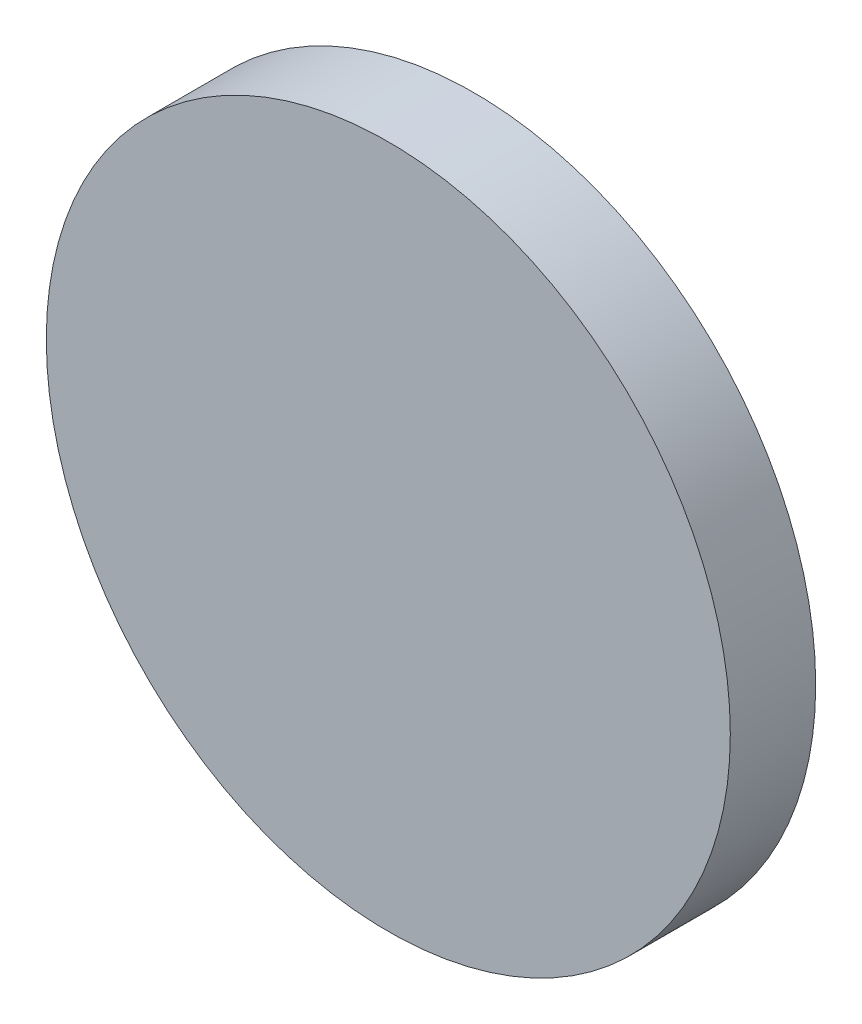
ISO-10303-21;
HEADER;
FILE_DESCRIPTION(('STEP AP214'),'2;1');
FILE_NAME('part.step','',(''),(''),'','','');
FILE_SCHEMA(('AUTOMOTIVE_DESIGN { 1 0 10303 214 1 1 1 1 }'));
ENDSEC;
DATA;
#1=APPLICATION_CONTEXT('core data for automotive mechanical design processes');
#2=APPLICATION_PROTOCOL_DEFINITION('international standard','automotive_design',2000,#1);
#3=PRODUCT_CONTEXT('',#1,'mechanical');
#4=PRODUCT('Part','Part','',(#3));
#5=PRODUCT_RELATED_PRODUCT_CATEGORY('part','',(#4));
#6=PRODUCT_DEFINITION_FORMATION('','',#4);
#7=PRODUCT_DEFINITION_CONTEXT('part definition',#1,'design');
#8=PRODUCT_DEFINITION('design','',#6,#7);
#9=PRODUCT_DEFINITION_SHAPE('','',#8);
#10=(LENGTH_UNIT() NAMED_UNIT(*) SI_UNIT(.MILLI.,.METRE.));
#11=(NAMED_UNIT(*) PLANE_ANGLE_UNIT() SI_UNIT($,.RADIAN.));
#12=(NAMED_UNIT(*) SI_UNIT($,.STERADIAN.) SOLID_ANGLE_UNIT());
#13=UNCERTAINTY_MEASURE_WITH_UNIT(LENGTH_MEASURE(1.E-05),#10,'distance_accuracy_value','');
#14=(GEOMETRIC_REPRESENTATION_CONTEXT(3) GLOBAL_UNCERTAINTY_ASSIGNED_CONTEXT((#13)) GLOBAL_UNIT_ASSIGNED_CONTEXT((#10,
#11,#12)) REPRESENTATION_CONTEXT('',''));
#15=CARTESIAN_POINT('',(0.,0.,0.));
#16=DIRECTION('',(0.,0.,1.));
#17=DIRECTION('',(1.,0.,0.));
#18=AXIS2_PLACEMENT_3D('',#15,#16,#17);
#19=CARTESIAN_POINT('',(-8.13110084681057,-7.04646753467841,50.));
#20=DIRECTION('',(0.,0.,-1.));
#21=DIRECTION('',(-1.,0.,0.));
#22=AXIS2_PLACEMENT_3D('',#19,#20,#21);
#23=CYLINDRICAL_SURFACE('',#22,200.28800815725);
#24=CARTESIAN_POINT('',(-8.13110084681057,-7.04646753467841,50.));
#25=DIRECTION('',(0.,0.,1.));
#26=DIRECTION('',(1.,0.,0.));
#27=AXIS2_PLACEMENT_3D('',#24,#25,#26);
#28=CIRCLE('',#27,200.28800815725);
#29=CARTESIAN_POINT('',(192.15690731044,-7.04646753467841,50.));
#30=VERTEX_POINT('',#29);
#31=EDGE_CURVE('E10',#30,#30,#28,.T.);
#32=ORIENTED_EDGE('',*,*,#31,.F.);
#33=EDGE_LOOP('',(#32));
#34=FACE_BOUND('',#33,.T.);
#35=CARTESIAN_POINT('',(-8.13110084681057,-7.04646753467841,0.));
#36=DIRECTION('',(0.,0.,1.));
#37=DIRECTION('',(1.,0.,0.));
#38=AXIS2_PLACEMENT_3D('',#35,#36,#37);
#39=CIRCLE('',#38,200.28800815725);
#40=CARTESIAN_POINT('',(192.15690731044,-7.04646753467841,0.));
#41=VERTEX_POINT('',#40);
#42=EDGE_CURVE('E36',#41,#41,#39,.T.);
#43=ORIENTED_EDGE('',*,*,#42,.T.);
#44=EDGE_LOOP('',(#43));
#45=FACE_BOUND('',#44,.T.);
#46=ADVANCED_FACE('F33',(#34,#45),#23,.T.);
#47=CARTESIAN_POINT('',(-8.13110084681057,-7.04646753467841,50.));
#48=DIRECTION('',(0.,0.,1.));
#49=DIRECTION('',(1.,0.,0.));
#50=AXIS2_PLACEMENT_3D('',#47,#48,#49);
#51=PLANE('',#50);
#52=ORIENTED_EDGE('',*,*,#31,.T.);
#53=EDGE_LOOP('',(#52));
#54=FACE_BOUND('',#53,.T.);
#55=ADVANCED_FACE('F48',(#54),#51,.T.);
#56=CARTESIAN_POINT('',(-8.13110084681057,-7.04646753467841,0.));
#57=DIRECTION('',(0.,0.,1.));
#58=DIRECTION('',(1.,0.,0.));
#59=AXIS2_PLACEMENT_3D('',#56,#57,#58);
#60=PLANE('',#59);
#61=ORIENTED_EDGE('',*,*,#42,.F.);
#62=EDGE_LOOP('',(#61));
#63=FACE_BOUND('',#62,.T.);
#64=ADVANCED_FACE('F46',(#63),#60,.F.);
#65=CLOSED_SHELL('',(#46,#55,#64));
#66=MANIFOLD_SOLID_BREP('B2',#65);
#67=ADVANCED_BREP_SHAPE_REPRESENTATION('',(#18,#66),#14);
#68=SHAPE_DEFINITION_REPRESENTATION(#9,#67);
ENDSEC;
END-ISO-10303-21;
